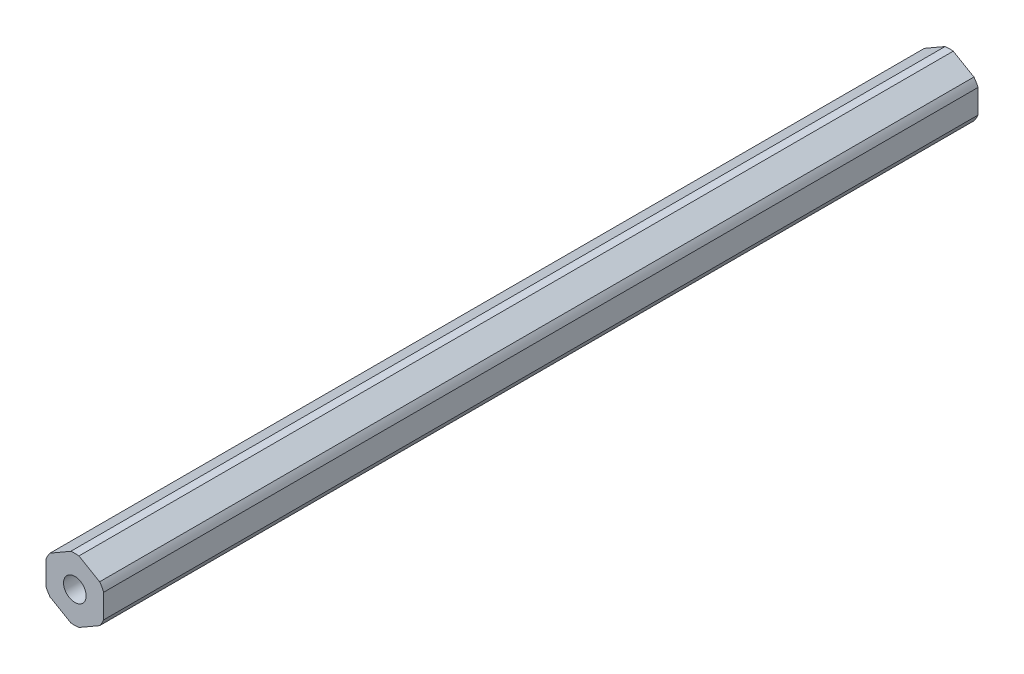
ISO-10303-21;
HEADER;
FILE_DESCRIPTION(('STEP AP214'),'2;1');
FILE_NAME('part.step','',(''),(''),'','','');
FILE_SCHEMA(('AUTOMOTIVE_DESIGN { 1 0 10303 214 1 1 1 1 }'));
ENDSEC;
DATA;
#1=APPLICATION_CONTEXT('core data for automotive mechanical design processes');
#2=APPLICATION_PROTOCOL_DEFINITION('international standard','automotive_design',2000,#1);
#3=PRODUCT_CONTEXT('',#1,'mechanical');
#4=PRODUCT('Part','Part','',(#3));
#5=PRODUCT_RELATED_PRODUCT_CATEGORY('part','',(#4));
#6=PRODUCT_DEFINITION_FORMATION('','',#4);
#7=PRODUCT_DEFINITION_CONTEXT('part definition',#1,'design');
#8=PRODUCT_DEFINITION('design','',#6,#7);
#9=PRODUCT_DEFINITION_SHAPE('','',#8);
#10=(LENGTH_UNIT() NAMED_UNIT(*) SI_UNIT(.MILLI.,.METRE.));
#11=(NAMED_UNIT(*) PLANE_ANGLE_UNIT() SI_UNIT($,.RADIAN.));
#12=(NAMED_UNIT(*) SI_UNIT($,.STERADIAN.) SOLID_ANGLE_UNIT());
#13=UNCERTAINTY_MEASURE_WITH_UNIT(LENGTH_MEASURE(1.E-05),#10,'distance_accuracy_value','');
#14=(GEOMETRIC_REPRESENTATION_CONTEXT(3) GLOBAL_UNCERTAINTY_ASSIGNED_CONTEXT((#13)) GLOBAL_UNIT_ASSIGNED_CONTEXT((#10,
#11,#12)) REPRESENTATION_CONTEXT('',''));
#15=CARTESIAN_POINT('',(0.,0.,0.));
#16=DIRECTION('',(0.,0.,1.));
#17=DIRECTION('',(1.,0.,0.));
#18=AXIS2_PLACEMENT_3D('',#15,#16,#17);
#19=CARTESIAN_POINT('',(0.,0.,192.405));
#20=DIRECTION('',(0.,0.,-1.));
#21=DIRECTION('',(-1.,0.,0.));
#22=AXIS2_PLACEMENT_3D('',#19,#20,#21);
#23=CYLINDRICAL_SURFACE('',#22,6.875);
#24=CARTESIAN_POINT('',(0.,0.,0.));
#25=DIRECTION('',(0.,0.,1.));
#26=DIRECTION('',(1.,0.,0.));
#27=AXIS2_PLACEMENT_3D('',#24,#25,#26);
#28=CIRCLE('',#27,6.875);
#29=CARTESIAN_POINT('',(0.893039494206787,6.81675182633099,0.));
#30=VERTEX_POINT('',#29);
#31=CARTESIAN_POINT('',(-0.893039494206797,6.81675182633099,0.));
#32=VERTEX_POINT('',#31);
#33=EDGE_CURVE('E171',#30,#32,#28,.T.);
#34=ORIENTED_EDGE('',*,*,#33,.T.);
#35=DIRECTION('',(0.,0.,-1.));
#36=VECTOR('',#35,1.);
#37=CARTESIAN_POINT('',(-0.893039494206797,6.81675182633099,192.405));
#38=LINE('',#37,#36);
#39=CARTESIAN_POINT('',(-0.893039494206797,6.81675182633099,192.405));
#40=VERTEX_POINT('',#39);
#41=EDGE_CURVE('E11',#40,#32,#38,.T.);
#42=ORIENTED_EDGE('',*,*,#41,.F.);
#43=CARTESIAN_POINT('',(0.,0.,192.405));
#44=DIRECTION('',(0.,0.,1.));
#45=DIRECTION('',(1.,0.,0.));
#46=AXIS2_PLACEMENT_3D('',#43,#44,#45);
#47=CIRCLE('',#46,6.875);
#48=CARTESIAN_POINT('',(0.893039494206787,6.81675182633099,192.405));
#49=VERTEX_POINT('',#48);
#50=EDGE_CURVE('E205',#49,#40,#47,.T.);
#51=ORIENTED_EDGE('',*,*,#50,.F.);
#52=DIRECTION('',(0.,0.,-1.));
#53=VECTOR('',#52,1.);
#54=CARTESIAN_POINT('',(0.893039494206787,6.81675182633099,192.405));
#55=LINE('',#54,#53);
#56=EDGE_CURVE('E167',#49,#30,#55,.T.);
#57=ORIENTED_EDGE('',*,*,#56,.T.);
#58=EDGE_LOOP('',(#34,#42,#51,#57));
#59=FACE_BOUND('',#58,.T.);
#60=ADVANCED_FACE('F45',(#59),#23,.T.);
#61=CARTESIAN_POINT('',(-0.893039494206797,6.81675182633099,192.405));
#62=DIRECTION('',(0.5,-0.866025403784439,0.));
#63=DIRECTION('',(0.866025403784439,0.5,0.));
#64=AXIS2_PLACEMENT_3D('',#61,#62,#63);
#65=PLANE('',#64);
#66=DIRECTION('',(-0.866025403784439,-0.5,0.));
#67=VECTOR('',#66,1.);
#68=CARTESIAN_POINT('',(-0.893039494206797,6.81675182633099,0.));
#69=LINE('',#68,#67);
#70=CARTESIAN_POINT('',(-5.45696050579321,4.18177080173138,0.));
#71=VERTEX_POINT('',#70);
#72=EDGE_CURVE('E175',#32,#71,#69,.T.);
#73=ORIENTED_EDGE('',*,*,#72,.T.);
#74=DIRECTION('',(0.,0.,-1.));
#75=VECTOR('',#74,1.);
#76=CARTESIAN_POINT('',(-5.45696050579321,4.18177080173138,192.405));
#77=LINE('',#76,#75);
#78=CARTESIAN_POINT('',(-5.45696050579321,4.18177080173138,192.405));
#79=VERTEX_POINT('',#78);
#80=EDGE_CURVE('E55',#79,#71,#77,.T.);
#81=ORIENTED_EDGE('',*,*,#80,.F.);
#82=DIRECTION('',(-0.866025403784439,-0.5,0.));
#83=VECTOR('',#82,1.);
#84=CARTESIAN_POINT('',(-0.893039494206797,6.81675182633099,192.405));
#85=LINE('',#84,#83);
#86=EDGE_CURVE('E118',#40,#79,#85,.T.);
#87=ORIENTED_EDGE('',*,*,#86,.F.);
#88=ORIENTED_EDGE('',*,*,#41,.T.);
#89=EDGE_LOOP('',(#73,#81,#87,#88));
#90=FACE_BOUND('',#89,.T.);
#91=ADVANCED_FACE('F301',(#90),#65,.F.);
#92=CARTESIAN_POINT('',(0.,0.,192.405));
#93=DIRECTION('',(0.,0.,-1.));
#94=DIRECTION('',(-1.,0.,0.));
#95=AXIS2_PLACEMENT_3D('',#92,#93,#94);
#96=CYLINDRICAL_SURFACE('',#95,6.875);
#97=CARTESIAN_POINT('',(0.,0.,0.));
#98=DIRECTION('',(0.,0.,1.));
#99=DIRECTION('',(1.,0.,0.));
#100=AXIS2_PLACEMENT_3D('',#97,#98,#99);
#101=CIRCLE('',#100,6.875);
#102=CARTESIAN_POINT('',(-6.35,2.63498102459961,0.));
#103=VERTEX_POINT('',#102);
#104=EDGE_CURVE('E178',#71,#103,#101,.T.);
#105=ORIENTED_EDGE('',*,*,#104,.T.);
#106=DIRECTION('',(0.,0.,-1.));
#107=VECTOR('',#106,1.);
#108=CARTESIAN_POINT('',(-6.35,2.63498102459961,192.405));
#109=LINE('',#108,#107);
#110=CARTESIAN_POINT('',(-6.35,2.63498102459961,192.405));
#111=VERTEX_POINT('',#110);
#112=EDGE_CURVE('E232',#111,#103,#109,.T.);
#113=ORIENTED_EDGE('',*,*,#112,.F.);
#114=CARTESIAN_POINT('',(0.,0.,192.405));
#115=DIRECTION('',(0.,0.,1.));
#116=DIRECTION('',(1.,0.,0.));
#117=AXIS2_PLACEMENT_3D('',#114,#115,#116);
#118=CIRCLE('',#117,6.875);
#119=EDGE_CURVE('E243',#79,#111,#118,.T.);
#120=ORIENTED_EDGE('',*,*,#119,.F.);
#121=ORIENTED_EDGE('',*,*,#80,.T.);
#122=EDGE_LOOP('',(#105,#113,#120,#121));
#123=FACE_BOUND('',#122,.T.);
#124=ADVANCED_FACE('F241',(#123),#96,.T.);
#125=CARTESIAN_POINT('',(-6.35,2.63498102459961,192.405));
#126=DIRECTION('',(1.,0.,0.));
#127=DIRECTION('',(0.,1.,0.));
#128=AXIS2_PLACEMENT_3D('',#125,#126,#127);
#129=PLANE('',#128);
#130=DIRECTION('',(0.,-1.,0.));
#131=VECTOR('',#130,1.);
#132=CARTESIAN_POINT('',(-6.35,2.63498102459961,0.));
#133=LINE('',#132,#131);
#134=CARTESIAN_POINT('',(-6.34999999999999,-2.63498102459962,0.));
#135=VERTEX_POINT('',#134);
#136=EDGE_CURVE('E181',#103,#135,#133,.T.);
#137=ORIENTED_EDGE('',*,*,#136,.T.);
#138=DIRECTION('',(0.,0.,-1.));
#139=VECTOR('',#138,1.);
#140=CARTESIAN_POINT('',(-6.34999999999999,-2.63498102459962,192.405));
#141=LINE('',#140,#139);
#142=CARTESIAN_POINT('',(-6.34999999999999,-2.63498102459962,192.405));
#143=VERTEX_POINT('',#142);
#144=EDGE_CURVE('E228',#143,#135,#141,.T.);
#145=ORIENTED_EDGE('',*,*,#144,.F.);
#146=DIRECTION('',(0.,-1.,0.));
#147=VECTOR('',#146,1.);
#148=CARTESIAN_POINT('',(-6.35,2.63498102459961,192.405));
#149=LINE('',#148,#147);
#150=EDGE_CURVE('E262',#111,#143,#149,.T.);
#151=ORIENTED_EDGE('',*,*,#150,.F.);
#152=ORIENTED_EDGE('',*,*,#112,.T.);
#153=EDGE_LOOP('',(#137,#145,#151,#152));
#154=FACE_BOUND('',#153,.T.);
#155=ADVANCED_FACE('F252',(#154),#129,.F.);
#156=CARTESIAN_POINT('',(0.,0.,192.405));
#157=DIRECTION('',(0.,0.,-1.));
#158=DIRECTION('',(-1.,0.,0.));
#159=AXIS2_PLACEMENT_3D('',#156,#157,#158);
#160=CYLINDRICAL_SURFACE('',#159,6.875);
#161=CARTESIAN_POINT('',(0.,0.,0.));
#162=DIRECTION('',(0.,0.,1.));
#163=DIRECTION('',(1.,0.,0.));
#164=AXIS2_PLACEMENT_3D('',#161,#162,#163);
#165=CIRCLE('',#164,6.875);
#166=CARTESIAN_POINT('',(-5.45696050579322,-4.18177080173137,0.));
#167=VERTEX_POINT('',#166);
#168=EDGE_CURVE('E184',#135,#167,#165,.T.);
#169=ORIENTED_EDGE('',*,*,#168,.T.);
#170=DIRECTION('',(0.,0.,-1.));
#171=VECTOR('',#170,1.);
#172=CARTESIAN_POINT('',(-5.45696050579322,-4.18177080173137,192.405));
#173=LINE('',#172,#171);
#174=CARTESIAN_POINT('',(-5.45696050579322,-4.18177080173137,192.405));
#175=VERTEX_POINT('',#174);
#176=EDGE_CURVE('E224',#175,#167,#173,.T.);
#177=ORIENTED_EDGE('',*,*,#176,.F.);
#178=CARTESIAN_POINT('',(0.,0.,192.405));
#179=DIRECTION('',(0.,0.,1.));
#180=DIRECTION('',(1.,0.,0.));
#181=AXIS2_PLACEMENT_3D('',#178,#179,#180);
#182=CIRCLE('',#181,6.875);
#183=EDGE_CURVE('E258',#143,#175,#182,.T.);
#184=ORIENTED_EDGE('',*,*,#183,.F.);
#185=ORIENTED_EDGE('',*,*,#144,.T.);
#186=EDGE_LOOP('',(#169,#177,#184,#185));
#187=FACE_BOUND('',#186,.T.);
#188=ADVANCED_FACE('F256',(#187),#160,.T.);
#189=CARTESIAN_POINT('',(-5.45696050579322,-4.18177080173137,192.405));
#190=DIRECTION('',(0.5,0.866025403784439,0.));
#191=DIRECTION('',(-0.866025403784439,0.5,0.));
#192=AXIS2_PLACEMENT_3D('',#189,#190,#191);
#193=PLANE('',#192);
#194=DIRECTION('',(0.866025403784439,-0.5,0.));
#195=VECTOR('',#194,1.);
#196=CARTESIAN_POINT('',(-5.45696050579322,-4.18177080173137,0.));
#197=LINE('',#196,#195);
#198=CARTESIAN_POINT('',(-0.893039494206769,-6.81675182633099,0.));
#199=VERTEX_POINT('',#198);
#200=EDGE_CURVE('E187',#167,#199,#197,.T.);
#201=ORIENTED_EDGE('',*,*,#200,.T.);
#202=DIRECTION('',(0.,0.,-1.));
#203=VECTOR('',#202,1.);
#204=CARTESIAN_POINT('',(-0.893039494206769,-6.81675182633099,192.405));
#205=LINE('',#204,#203);
#206=CARTESIAN_POINT('',(-0.893039494206769,-6.81675182633099,192.405));
#207=VERTEX_POINT('',#206);
#208=EDGE_CURVE('E220',#207,#199,#205,.T.);
#209=ORIENTED_EDGE('',*,*,#208,.F.);
#210=DIRECTION('',(0.866025403784439,-0.5,0.));
#211=VECTOR('',#210,1.);
#212=CARTESIAN_POINT('',(-5.45696050579322,-4.18177080173137,192.405));
#213=LINE('',#212,#211);
#214=EDGE_CURVE('E261',#175,#207,#213,.T.);
#215=ORIENTED_EDGE('',*,*,#214,.F.);
#216=ORIENTED_EDGE('',*,*,#176,.T.);
#217=EDGE_LOOP('',(#201,#209,#215,#216));
#218=FACE_BOUND('',#217,.T.);
#219=ADVANCED_FACE('F314',(#218),#193,.F.);
#220=CARTESIAN_POINT('',(0.,0.,192.405));
#221=DIRECTION('',(0.,0.,-1.));
#222=DIRECTION('',(-1.,0.,0.));
#223=AXIS2_PLACEMENT_3D('',#220,#221,#222);
#224=CYLINDRICAL_SURFACE('',#223,6.875);
#225=CARTESIAN_POINT('',(0.,0.,0.));
#226=DIRECTION('',(0.,0.,1.));
#227=DIRECTION('',(1.,0.,0.));
#228=AXIS2_PLACEMENT_3D('',#225,#226,#227);
#229=CIRCLE('',#228,6.875);
#230=CARTESIAN_POINT('',(0.893039494206767,-6.81675182633099,0.));
#231=VERTEX_POINT('',#230);
#232=EDGE_CURVE('E190',#199,#231,#229,.T.);
#233=ORIENTED_EDGE('',*,*,#232,.T.);
#234=DIRECTION('',(0.,0.,-1.));
#235=VECTOR('',#234,1.);
#236=CARTESIAN_POINT('',(0.893039494206767,-6.81675182633099,192.405));
#237=LINE('',#236,#235);
#238=CARTESIAN_POINT('',(0.893039494206767,-6.81675182633099,192.405));
#239=VERTEX_POINT('',#238);
#240=EDGE_CURVE('E216',#239,#231,#237,.T.);
#241=ORIENTED_EDGE('',*,*,#240,.F.);
#242=CARTESIAN_POINT('',(0.,0.,192.405));
#243=DIRECTION('',(0.,0.,1.));
#244=DIRECTION('',(1.,0.,0.));
#245=AXIS2_PLACEMENT_3D('',#242,#243,#244);
#246=CIRCLE('',#245,6.875);
#247=EDGE_CURVE('E266',#207,#239,#246,.T.);
#248=ORIENTED_EDGE('',*,*,#247,.F.);
#249=ORIENTED_EDGE('',*,*,#208,.T.);
#250=EDGE_LOOP('',(#233,#241,#248,#249));
#251=FACE_BOUND('',#250,.T.);
#252=ADVANCED_FACE('F317',(#251),#224,.T.);
#253=CARTESIAN_POINT('',(0.893039494206767,-6.81675182633099,192.405));
#254=DIRECTION('',(-0.499999999999999,0.866025403784439,0.));
#255=DIRECTION('',(-0.866025403784439,-0.5,0.));
#256=AXIS2_PLACEMENT_3D('',#253,#254,#255);
#257=PLANE('',#256);
#258=DIRECTION('',(0.866025403784439,0.499999999999999,0.));
#259=VECTOR('',#258,1.);
#260=CARTESIAN_POINT('',(0.893039494206767,-6.81675182633099,0.));
#261=LINE('',#260,#259);
#262=CARTESIAN_POINT('',(5.45696050579322,-4.18177080173137,0.));
#263=VERTEX_POINT('',#262);
#264=EDGE_CURVE('E193',#231,#263,#261,.T.);
#265=ORIENTED_EDGE('',*,*,#264,.T.);
#266=DIRECTION('',(0.,0.,-1.));
#267=VECTOR('',#266,1.);
#268=CARTESIAN_POINT('',(5.45696050579322,-4.18177080173137,192.405));
#269=LINE('',#268,#267);
#270=CARTESIAN_POINT('',(5.45696050579322,-4.18177080173137,192.405));
#271=VERTEX_POINT('',#270);
#272=EDGE_CURVE('E212',#271,#263,#269,.T.);
#273=ORIENTED_EDGE('',*,*,#272,.F.);
#274=DIRECTION('',(0.866025403784439,0.499999999999999,0.));
#275=VECTOR('',#274,1.);
#276=CARTESIAN_POINT('',(0.893039494206767,-6.81675182633099,192.405));
#277=LINE('',#276,#275);
#278=EDGE_CURVE('E273',#239,#271,#277,.T.);
#279=ORIENTED_EDGE('',*,*,#278,.F.);
#280=ORIENTED_EDGE('',*,*,#240,.T.);
#281=EDGE_LOOP('',(#265,#273,#279,#280));
#282=FACE_BOUND('',#281,.T.);
#283=ADVANCED_FACE('F281',(#282),#257,.F.);
#284=CARTESIAN_POINT('',(0.,0.,192.405));
#285=DIRECTION('',(0.,0.,-1.));
#286=DIRECTION('',(-1.,0.,0.));
#287=AXIS2_PLACEMENT_3D('',#284,#285,#286);
#288=CYLINDRICAL_SURFACE('',#287,6.875);
#289=CARTESIAN_POINT('',(0.,0.,0.));
#290=DIRECTION('',(0.,0.,1.));
#291=DIRECTION('',(1.,0.,0.));
#292=AXIS2_PLACEMENT_3D('',#289,#290,#291);
#293=CIRCLE('',#292,6.875);
#294=CARTESIAN_POINT('',(6.34999999999998,-2.63498102459965,0.));
#295=VERTEX_POINT('',#294);
#296=EDGE_CURVE('E196',#263,#295,#293,.T.);
#297=ORIENTED_EDGE('',*,*,#296,.T.);
#298=DIRECTION('',(0.,0.,-1.));
#299=VECTOR('',#298,1.);
#300=CARTESIAN_POINT('',(6.34999999999998,-2.63498102459965,192.405));
#301=LINE('',#300,#299);
#302=CARTESIAN_POINT('',(6.34999999999998,-2.63498102459965,192.405));
#303=VERTEX_POINT('',#302);
#304=EDGE_CURVE('E160',#303,#295,#301,.T.);
#305=ORIENTED_EDGE('',*,*,#304,.F.);
#306=CARTESIAN_POINT('',(0.,0.,192.405));
#307=DIRECTION('',(0.,0.,1.));
#308=DIRECTION('',(1.,0.,0.));
#309=AXIS2_PLACEMENT_3D('',#306,#307,#308);
#310=CIRCLE('',#309,6.875);
#311=EDGE_CURVE('E149',#271,#303,#310,.T.);
#312=ORIENTED_EDGE('',*,*,#311,.F.);
#313=ORIENTED_EDGE('',*,*,#272,.T.);
#314=EDGE_LOOP('',(#297,#305,#312,#313));
#315=FACE_BOUND('',#314,.T.);
#316=ADVANCED_FACE('F285',(#315),#288,.T.);
#317=CARTESIAN_POINT('',(6.34999999999998,-2.63498102459965,192.405));
#318=DIRECTION('',(-1.,0.,0.));
#319=DIRECTION('',(0.,-1.,0.));
#320=AXIS2_PLACEMENT_3D('',#317,#318,#319);
#321=PLANE('',#320);
#322=DIRECTION('',(0.,1.,0.));
#323=VECTOR('',#322,1.);
#324=CARTESIAN_POINT('',(6.34999999999998,-2.63498102459965,0.));
#325=LINE('',#324,#323);
#326=CARTESIAN_POINT('',(6.34999999999998,2.63498102459965,0.));
#327=VERTEX_POINT('',#326);
#328=EDGE_CURVE('E158',#295,#327,#325,.T.);
#329=ORIENTED_EDGE('',*,*,#328,.T.);
#330=DIRECTION('',(0.,0.,-1.));
#331=VECTOR('',#330,1.);
#332=CARTESIAN_POINT('',(6.34999999999998,2.63498102459965,192.405));
#333=LINE('',#332,#331);
#334=CARTESIAN_POINT('',(6.34999999999998,2.63498102459965,192.405));
#335=VERTEX_POINT('',#334);
#336=EDGE_CURVE('E155',#335,#327,#333,.T.);
#337=ORIENTED_EDGE('',*,*,#336,.F.);
#338=DIRECTION('',(0.,1.,0.));
#339=VECTOR('',#338,1.);
#340=CARTESIAN_POINT('',(6.34999999999998,-2.63498102459965,192.405));
#341=LINE('',#340,#339);
#342=EDGE_CURVE('E143',#303,#335,#341,.T.);
#343=ORIENTED_EDGE('',*,*,#342,.F.);
#344=ORIENTED_EDGE('',*,*,#304,.T.);
#345=EDGE_LOOP('',(#329,#337,#343,#344));
#346=FACE_BOUND('',#345,.T.);
#347=ADVANCED_FACE('F156',(#346),#321,.F.);
#348=CARTESIAN_POINT('',(0.,0.,192.405));
#349=DIRECTION('',(0.,0.,-1.));
#350=DIRECTION('',(-1.,0.,0.));
#351=AXIS2_PLACEMENT_3D('',#348,#349,#350);
#352=CYLINDRICAL_SURFACE('',#351,6.875);
#353=CARTESIAN_POINT('',(0.,0.,0.));
#354=DIRECTION('',(0.,0.,1.));
#355=DIRECTION('',(1.,0.,0.));
#356=AXIS2_PLACEMENT_3D('',#353,#354,#355);
#357=CIRCLE('',#356,6.875);
#358=CARTESIAN_POINT('',(5.45696050579321,4.18177080173138,0.));
#359=VERTEX_POINT('',#358);
#360=EDGE_CURVE('E104',#327,#359,#357,.T.);
#361=ORIENTED_EDGE('',*,*,#360,.T.);
#362=DIRECTION('',(0.,0.,-1.));
#363=VECTOR('',#362,1.);
#364=CARTESIAN_POINT('',(5.45696050579321,4.18177080173138,192.405));
#365=LINE('',#364,#363);
#366=CARTESIAN_POINT('',(5.45696050579321,4.18177080173138,192.405));
#367=VERTEX_POINT('',#366);
#368=EDGE_CURVE('E161',#367,#359,#365,.T.);
#369=ORIENTED_EDGE('',*,*,#368,.F.);
#370=CARTESIAN_POINT('',(0.,0.,192.405));
#371=DIRECTION('',(0.,0.,1.));
#372=DIRECTION('',(1.,0.,0.));
#373=AXIS2_PLACEMENT_3D('',#370,#371,#372);
#374=CIRCLE('',#373,6.875);
#375=EDGE_CURVE('E147',#335,#367,#374,.T.);
#376=ORIENTED_EDGE('',*,*,#375,.F.);
#377=ORIENTED_EDGE('',*,*,#336,.T.);
#378=EDGE_LOOP('',(#361,#369,#376,#377));
#379=FACE_BOUND('',#378,.T.);
#380=ADVANCED_FACE('F163',(#379),#352,.T.);
#381=CARTESIAN_POINT('',(5.45696050579321,4.18177080173138,192.405));
#382=DIRECTION('',(-0.5,-0.866025403784439,0.));
#383=DIRECTION('',(0.866025403784439,-0.5,0.));
#384=AXIS2_PLACEMENT_3D('',#381,#382,#383);
#385=PLANE('',#384);
#386=DIRECTION('',(-0.866025403784439,0.5,0.));
#387=VECTOR('',#386,1.);
#388=CARTESIAN_POINT('',(5.45696050579321,4.18177080173138,0.));
#389=LINE('',#388,#387);
#390=EDGE_CURVE('E110',#359,#30,#389,.T.);
#391=ORIENTED_EDGE('',*,*,#390,.T.);
#392=ORIENTED_EDGE('',*,*,#56,.F.);
#393=DIRECTION('',(-0.866025403784439,0.5,0.));
#394=VECTOR('',#393,1.);
#395=CARTESIAN_POINT('',(5.45696050579321,4.18177080173138,192.405));
#396=LINE('',#395,#394);
#397=EDGE_CURVE('E63',#367,#49,#396,.T.);
#398=ORIENTED_EDGE('',*,*,#397,.F.);
#399=ORIENTED_EDGE('',*,*,#368,.T.);
#400=EDGE_LOOP('',(#391,#392,#398,#399));
#401=FACE_BOUND('',#400,.T.);
#402=ADVANCED_FACE('F289',(#401),#385,.F.);
#403=CARTESIAN_POINT('',(0.,0.,192.405));
#404=DIRECTION('',(0.,0.,1.));
#405=DIRECTION('',(1.,0.,0.));
#406=AXIS2_PLACEMENT_3D('',#403,#404,#405);
#407=PLANE('',#406);
#408=CARTESIAN_POINT('',(0.,0.,192.405));
#409=DIRECTION('',(0.,0.,-1.));
#410=DIRECTION('',(-1.,0.,0.));
#411=AXIS2_PLACEMENT_3D('',#408,#409,#410);
#412=CIRCLE('',#411,2.4892);
#413=CARTESIAN_POINT('',(-2.4892,0.,192.405));
#414=VERTEX_POINT('',#413);
#415=EDGE_CURVE('E371',#414,#414,#412,.T.);
#416=ORIENTED_EDGE('',*,*,#415,.T.);
#417=EDGE_LOOP('',(#416));
#418=FACE_BOUND('',#417,.T.);
#419=ORIENTED_EDGE('',*,*,#50,.T.);
#420=ORIENTED_EDGE('',*,*,#86,.T.);
#421=ORIENTED_EDGE('',*,*,#119,.T.);
#422=ORIENTED_EDGE('',*,*,#150,.T.);
#423=ORIENTED_EDGE('',*,*,#183,.T.);
#424=ORIENTED_EDGE('',*,*,#214,.T.);
#425=ORIENTED_EDGE('',*,*,#247,.T.);
#426=ORIENTED_EDGE('',*,*,#278,.T.);
#427=ORIENTED_EDGE('',*,*,#311,.T.);
#428=ORIENTED_EDGE('',*,*,#342,.T.);
#429=ORIENTED_EDGE('',*,*,#375,.T.);
#430=ORIENTED_EDGE('',*,*,#397,.T.);
#431=EDGE_LOOP('',(#419,#420,#421,#422,#423,#424,#425,#426,#427,#428,#429,#430));
#432=FACE_BOUND('',#431,.T.);
#433=ADVANCED_FACE('F145',(#418,#432),#407,.T.);
#434=CARTESIAN_POINT('',(0.,0.,0.));
#435=DIRECTION('',(0.,0.,1.));
#436=DIRECTION('',(1.,0.,0.));
#437=AXIS2_PLACEMENT_3D('',#434,#435,#436);
#438=PLANE('',#437);
#439=CARTESIAN_POINT('',(0.,0.,0.));
#440=DIRECTION('',(0.,0.,1.));
#441=DIRECTION('',(1.,0.,0.));
#442=AXIS2_PLACEMENT_3D('',#439,#440,#441);
#443=CIRCLE('',#442,2.4892);
#444=CARTESIAN_POINT('',(-2.4892,0.,0.));
#445=VERTEX_POINT('',#444);
#446=EDGE_CURVE('E48',#445,#445,#443,.T.);
#447=ORIENTED_EDGE('',*,*,#446,.T.);
#448=EDGE_LOOP('',(#447));
#449=FACE_BOUND('',#448,.T.);
#450=ORIENTED_EDGE('',*,*,#33,.F.);
#451=ORIENTED_EDGE('',*,*,#390,.F.);
#452=ORIENTED_EDGE('',*,*,#360,.F.);
#453=ORIENTED_EDGE('',*,*,#328,.F.);
#454=ORIENTED_EDGE('',*,*,#296,.F.);
#455=ORIENTED_EDGE('',*,*,#264,.F.);
#456=ORIENTED_EDGE('',*,*,#232,.F.);
#457=ORIENTED_EDGE('',*,*,#200,.F.);
#458=ORIENTED_EDGE('',*,*,#168,.F.);
#459=ORIENTED_EDGE('',*,*,#136,.F.);
#460=ORIENTED_EDGE('',*,*,#104,.F.);
#461=ORIENTED_EDGE('',*,*,#72,.F.);
#462=EDGE_LOOP('',(#450,#451,#452,#453,#454,#455,#456,#457,#458,#459,#460,#461));
#463=FACE_BOUND('',#462,.T.);
#464=ADVANCED_FACE('F247',(#449,#463),#438,.F.);
#465=CARTESIAN_POINT('',(0.,0.,192.405));
#466=DIRECTION('',(0.,0.,-1.));
#467=DIRECTION('',(-1.,0.,0.));
#468=AXIS2_PLACEMENT_3D('',#465,#466,#467);
#469=CYLINDRICAL_SURFACE('',#468,2.4892);
#470=CARTESIAN_POINT('',(-2.4892,0.,192.405));
#471=CARTESIAN_POINT('',(-2.4892,0.,190.40078125));
#472=CARTESIAN_POINT('',(-2.4892,0.,188.3965625));
#473=CARTESIAN_POINT('',(-2.4892,0.,184.388125));
#474=CARTESIAN_POINT('',(-2.4892,0.,182.38390625));
#475=CARTESIAN_POINT('',(-2.4892,0.,178.37546875));
#476=CARTESIAN_POINT('',(-2.4892,0.,176.37125));
#477=CARTESIAN_POINT('',(-2.4892,0.,172.3628125));
#478=CARTESIAN_POINT('',(-2.4892,0.,170.35859375));
#479=CARTESIAN_POINT('',(-2.4892,0.,166.35015625));
#480=CARTESIAN_POINT('',(-2.4892,0.,164.3459375));
#481=CARTESIAN_POINT('',(-2.4892,0.,160.3375));
#482=CARTESIAN_POINT('',(-2.4892,0.,158.33328125));
#483=CARTESIAN_POINT('',(-2.4892,0.,154.32484375));
#484=CARTESIAN_POINT('',(-2.4892,0.,152.320625));
#485=CARTESIAN_POINT('',(-2.4892,0.,148.3121875));
#486=CARTESIAN_POINT('',(-2.4892,0.,146.30796875));
#487=CARTESIAN_POINT('',(-2.4892,0.,142.29953125));
#488=CARTESIAN_POINT('',(-2.4892,0.,140.2953125));
#489=CARTESIAN_POINT('',(-2.4892,0.,136.286875));
#490=CARTESIAN_POINT('',(-2.4892,0.,134.28265625));
#491=CARTESIAN_POINT('',(-2.4892,0.,130.27421875));
#492=CARTESIAN_POINT('',(-2.4892,0.,128.27));
#493=CARTESIAN_POINT('',(-2.4892,0.,124.2615625));
#494=CARTESIAN_POINT('',(-2.4892,0.,122.25734375));
#495=CARTESIAN_POINT('',(-2.4892,0.,118.24890625));
#496=CARTESIAN_POINT('',(-2.4892,0.,116.2446875));
#497=CARTESIAN_POINT('',(-2.4892,0.,112.23625));
#498=CARTESIAN_POINT('',(-2.4892,0.,110.23203125));
#499=CARTESIAN_POINT('',(-2.4892,0.,106.22359375));
#500=CARTESIAN_POINT('',(-2.4892,0.,104.219375));
#501=CARTESIAN_POINT('',(-2.4892,0.,100.2109375));
#502=CARTESIAN_POINT('',(-2.4892,0.,98.20671875));
#503=CARTESIAN_POINT('',(-2.4892,0.,94.19828125));
#504=CARTESIAN_POINT('',(-2.4892,0.,92.1940625));
#505=CARTESIAN_POINT('',(-2.4892,0.,88.185625));
#506=CARTESIAN_POINT('',(-2.4892,0.,86.18140625));
#507=CARTESIAN_POINT('',(-2.4892,0.,82.17296875));
#508=CARTESIAN_POINT('',(-2.4892,0.,80.16875));
#509=CARTESIAN_POINT('',(-2.4892,0.,76.1603125));
#510=CARTESIAN_POINT('',(-2.4892,0.,74.15609375));
#511=CARTESIAN_POINT('',(-2.4892,0.,70.14765625));
#512=CARTESIAN_POINT('',(-2.4892,0.,68.1434375));
#513=CARTESIAN_POINT('',(-2.4892,0.,64.135));
#514=CARTESIAN_POINT('',(-2.4892,0.,62.13078125));
#515=CARTESIAN_POINT('',(-2.4892,0.,58.12234375));
#516=CARTESIAN_POINT('',(-2.4892,0.,56.118125));
#517=CARTESIAN_POINT('',(-2.4892,0.,52.1096875));
#518=CARTESIAN_POINT('',(-2.4892,0.,50.10546875));
#519=CARTESIAN_POINT('',(-2.4892,0.,46.09703125));
#520=CARTESIAN_POINT('',(-2.4892,0.,44.0928125));
#521=CARTESIAN_POINT('',(-2.4892,0.,40.084375));
#522=CARTESIAN_POINT('',(-2.4892,0.,38.08015625));
#523=CARTESIAN_POINT('',(-2.4892,0.,34.07171875));
#524=CARTESIAN_POINT('',(-2.4892,0.,32.0675));
#525=CARTESIAN_POINT('',(-2.4892,0.,28.0590625));
#526=CARTESIAN_POINT('',(-2.4892,0.,26.05484375));
#527=CARTESIAN_POINT('',(-2.4892,0.,22.04640625));
#528=CARTESIAN_POINT('',(-2.4892,0.,20.0421875));
#529=CARTESIAN_POINT('',(-2.4892,0.,16.03375));
#530=CARTESIAN_POINT('',(-2.4892,0.,14.02953125));
#531=CARTESIAN_POINT('',(-2.4892,0.,10.02109375));
#532=CARTESIAN_POINT('',(-2.4892,0.,8.01687499999997));
#533=CARTESIAN_POINT('',(-2.4892,0.,4.00843749999997));
#534=CARTESIAN_POINT('',(-2.4892,0.,2.00421874999997));
#535=CARTESIAN_POINT('',(-2.4892,0.,0.));
#536=B_SPLINE_CURVE_WITH_KNOTS('',3,(#470,#471,#472,#473,#474,#475,#476,#477,#478,#479,#480,
#481,#482,#483,#484,#485,#486,#487,#488,#489,#490,#491,#492,#493,#494,#495,#496,#497,#498,#499,
#500,#501,#502,#503,#504,#505,#506,#507,#508,#509,#510,#511,#512,#513,#514,#515,#516,#517,#518,
#519,#520,#521,#522,#523,#524,#525,#526,#527,#528,#529,#530,#531,#532,#533,#534,#535),
.UNSPECIFIED.,.F.,.F.,(4,2,2,2,2,2,2,2,2,2,2,2,2,2,2,2,2,2,2,2,2,2,2,2,2,2,2,2,2,2,2,2,4),(0.,
6.01265625,12.0253125,18.03796875,24.050625,30.06328125,36.0759375,42.08859375,48.10125,
54.11390625,60.1265625,66.13921875,72.151875,78.16453125,84.1771875,90.18984375,96.2025,
102.21515625,108.2278125,114.24046875,120.253125,126.26578125,132.2784375,138.29109375,
144.30375,150.31640625,156.3290625,162.34171875,168.354375,174.36703125,180.3796875,
186.39234375,192.405),.UNSPECIFIED.);
#537=EDGE_CURVE('BSEAM356',#414,#445,#536,.T.);
#538=ORIENTED_EDGE('',*,*,#415,.F.);
#539=ORIENTED_EDGE('',*,*,#446,.F.);
#540=ORIENTED_EDGE('',*,*,#537,.T.);
#541=ORIENTED_EDGE('',*,*,#537,.F.);
#542=EDGE_LOOP('',(#538,#540,#539,#541));
#543=FACE_BOUND('',#542,.T.);
#544=ADVANCED_FACE('F356',(#543),#469,.F.);
#545=CLOSED_SHELL('',(#60,#91,#124,#155,#188,#219,#252,#283,#316,#347,#380,#402,#433,#464,#544));
#546=MANIFOLD_SOLID_BREP('B2',#545);
#547=ADVANCED_BREP_SHAPE_REPRESENTATION('',(#18,#546),#14);
#548=SHAPE_DEFINITION_REPRESENTATION(#9,#547);
ENDSEC;
END-ISO-10303-21;
